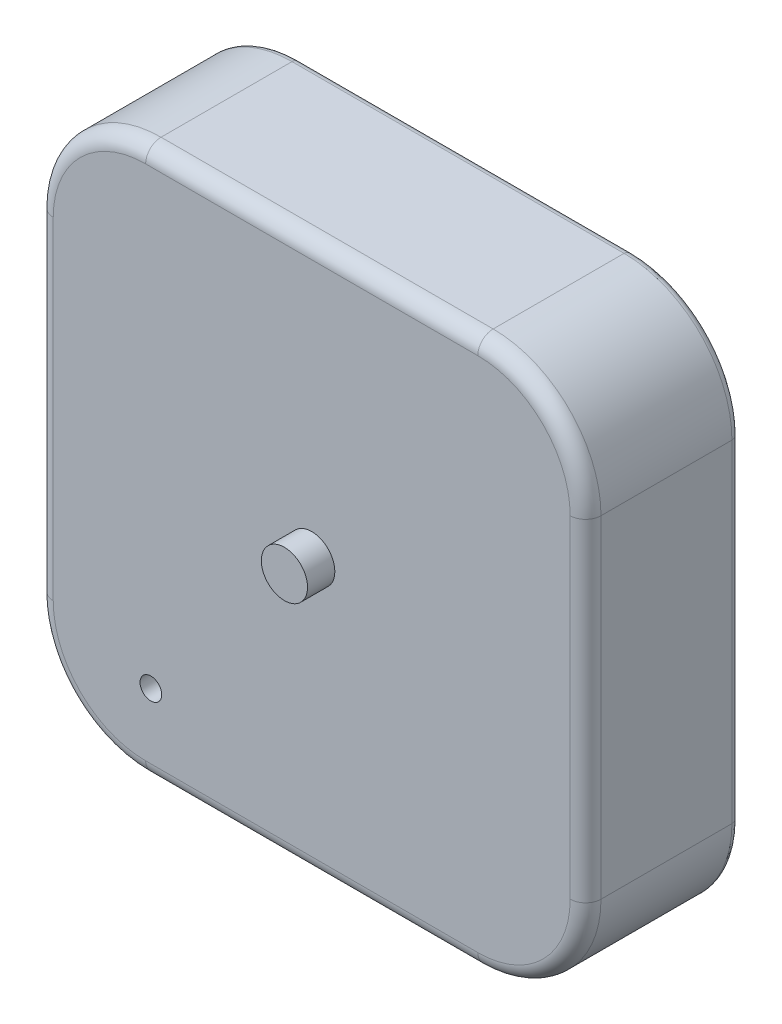
ISO-10303-21;
HEADER;
FILE_DESCRIPTION(('STEP AP214'),'2;1');
FILE_NAME('part.step','',(''),(''),'','','');
FILE_SCHEMA(('AUTOMOTIVE_DESIGN { 1 0 10303 214 1 1 1 1 }'));
ENDSEC;
DATA;
#1=APPLICATION_CONTEXT('core data for automotive mechanical design processes');
#2=APPLICATION_PROTOCOL_DEFINITION('international standard','automotive_design',2000,#1);
#3=PRODUCT_CONTEXT('',#1,'mechanical');
#4=PRODUCT('Part','Part','',(#3));
#5=PRODUCT_RELATED_PRODUCT_CATEGORY('part','',(#4));
#6=PRODUCT_DEFINITION_FORMATION('','',#4);
#7=PRODUCT_DEFINITION_CONTEXT('part definition',#1,'design');
#8=PRODUCT_DEFINITION('design','',#6,#7);
#9=PRODUCT_DEFINITION_SHAPE('','',#8);
#10=(LENGTH_UNIT() NAMED_UNIT(*) SI_UNIT(.MILLI.,.METRE.));
#11=(NAMED_UNIT(*) PLANE_ANGLE_UNIT() SI_UNIT($,.RADIAN.));
#12=(NAMED_UNIT(*) SI_UNIT($,.STERADIAN.) SOLID_ANGLE_UNIT());
#13=UNCERTAINTY_MEASURE_WITH_UNIT(LENGTH_MEASURE(1.E-05),#10,'distance_accuracy_value','');
#14=(GEOMETRIC_REPRESENTATION_CONTEXT(3) GLOBAL_UNCERTAINTY_ASSIGNED_CONTEXT((#13)) GLOBAL_UNIT_ASSIGNED_CONTEXT((#10,
#11,#12)) REPRESENTATION_CONTEXT('',''));
#15=CARTESIAN_POINT('',(0.,0.,0.));
#16=DIRECTION('',(0.,0.,1.));
#17=DIRECTION('',(1.,0.,0.));
#18=AXIS2_PLACEMENT_3D('',#15,#16,#17);
#19=CARTESIAN_POINT('',(0.,0.,0.));
#20=DIRECTION('',(0.,0.,1.));
#21=DIRECTION('',(1.,0.,0.));
#22=AXIS2_PLACEMENT_3D('',#19,#20,#21);
#23=PLANE('',#22);
#24=DIRECTION('',(1.,0.,0.));
#25=VECTOR('',#24,1.);
#26=CARTESIAN_POINT('',(0.,-172.8,0.));
#27=LINE('',#26,#25);
#28=CARTESIAN_POINT('',(107.8,-172.8,0.));
#29=VERTEX_POINT('',#28);
#30=CARTESIAN_POINT('',(-107.8,-172.8,0.));
#31=VERTEX_POINT('',#30);
#32=EDGE_CURVE('E189',#29,#31,#27,.F.);
#33=ORIENTED_EDGE('',*,*,#32,.T.);
#34=CARTESIAN_POINT('',(-107.8,-107.8,0.));
#35=DIRECTION('',(0.,0.,1.));
#36=DIRECTION('',(1.,0.,0.));
#37=AXIS2_PLACEMENT_3D('',#34,#35,#36);
#38=CIRCLE('',#37,65.);
#39=CARTESIAN_POINT('',(-172.8,-107.8,0.));
#40=VERTEX_POINT('',#39);
#41=EDGE_CURVE('E238',#31,#40,#38,.F.);
#42=ORIENTED_EDGE('',*,*,#41,.T.);
#43=DIRECTION('',(0.,-1.,0.));
#44=VECTOR('',#43,1.);
#45=CARTESIAN_POINT('',(-172.8,0.,0.));
#46=LINE('',#45,#44);
#47=CARTESIAN_POINT('',(-172.8,107.8,0.));
#48=VERTEX_POINT('',#47);
#49=EDGE_CURVE('E235',#40,#48,#46,.F.);
#50=ORIENTED_EDGE('',*,*,#49,.T.);
#51=CARTESIAN_POINT('',(-107.8,107.8,0.));
#52=DIRECTION('',(0.,0.,1.));
#53=DIRECTION('',(1.,0.,0.));
#54=AXIS2_PLACEMENT_3D('',#51,#52,#53);
#55=CIRCLE('',#54,65.);
#56=CARTESIAN_POINT('',(-107.8,172.8,0.));
#57=VERTEX_POINT('',#56);
#58=EDGE_CURVE('E232',#48,#57,#55,.F.);
#59=ORIENTED_EDGE('',*,*,#58,.T.);
#60=DIRECTION('',(1.,0.,0.));
#61=VECTOR('',#60,1.);
#62=CARTESIAN_POINT('',(107.8,172.8,0.));
#63=LINE('',#62,#61);
#64=CARTESIAN_POINT('',(107.8,172.8,0.));
#65=VERTEX_POINT('',#64);
#66=EDGE_CURVE('E229',#57,#65,#63,.T.);
#67=ORIENTED_EDGE('',*,*,#66,.T.);
#68=CARTESIAN_POINT('',(107.8,107.8,0.));
#69=DIRECTION('',(0.,0.,1.));
#70=DIRECTION('',(1.,0.,0.));
#71=AXIS2_PLACEMENT_3D('',#68,#69,#70);
#72=CIRCLE('',#71,65.);
#73=CARTESIAN_POINT('',(172.8,107.8,0.));
#74=VERTEX_POINT('',#73);
#75=EDGE_CURVE('E226',#65,#74,#72,.F.);
#76=ORIENTED_EDGE('',*,*,#75,.T.);
#77=DIRECTION('',(0.,-1.,0.));
#78=VECTOR('',#77,1.);
#79=CARTESIAN_POINT('',(172.8,-107.8,0.));
#80=LINE('',#79,#78);
#81=CARTESIAN_POINT('',(172.8,-107.8,0.));
#82=VERTEX_POINT('',#81);
#83=EDGE_CURVE('E192',#74,#82,#80,.T.);
#84=ORIENTED_EDGE('',*,*,#83,.T.);
#85=CARTESIAN_POINT('',(107.8,-107.8,0.));
#86=DIRECTION('',(0.,0.,1.));
#87=DIRECTION('',(1.,0.,0.));
#88=AXIS2_PLACEMENT_3D('',#85,#86,#87);
#89=CIRCLE('',#88,65.);
#90=EDGE_CURVE('E185',#82,#29,#89,.F.);
#91=ORIENTED_EDGE('',*,*,#90,.T.);
#92=EDGE_LOOP('',(#33,#42,#50,#59,#67,#76,#84,#91));
#93=FACE_BOUND('',#92,.T.);
#94=ADVANCED_FACE('F70',(#93),#23,.F.);
#95=CARTESIAN_POINT('',(-177.8,0.,100.));
#96=DIRECTION('',(1.,0.,0.));
#97=DIRECTION('',(0.,1.,0.));
#98=AXIS2_PLACEMENT_3D('',#95,#96,#97);
#99=PLANE('',#98);
#100=DIRECTION('',(0.,0.,-1.));
#101=VECTOR('',#100,1.);
#102=CARTESIAN_POINT('',(-177.8,-107.8,100.));
#103=LINE('',#102,#101);
#104=CARTESIAN_POINT('',(-177.8,-107.8,5.));
#105=VERTEX_POINT('',#104);
#106=CARTESIAN_POINT('',(-177.8,-107.8,90.));
#107=VERTEX_POINT('',#106);
#108=EDGE_CURVE('E215',#105,#107,#103,.F.);
#109=ORIENTED_EDGE('',*,*,#108,.T.);
#110=DIRECTION('',(0.,-1.,0.));
#111=VECTOR('',#110,1.);
#112=CARTESIAN_POINT('',(-177.8,107.8,90.));
#113=LINE('',#112,#111);
#114=CARTESIAN_POINT('',(-177.8,107.8,90.));
#115=VERTEX_POINT('',#114);
#116=EDGE_CURVE('E319',#107,#115,#113,.F.);
#117=ORIENTED_EDGE('',*,*,#116,.T.);
#118=DIRECTION('',(0.,0.,-1.));
#119=VECTOR('',#118,1.);
#120=CARTESIAN_POINT('',(-177.8,107.8,0.));
#121=LINE('',#120,#119);
#122=CARTESIAN_POINT('',(-177.8,107.8,5.));
#123=VERTEX_POINT('',#122);
#124=EDGE_CURVE('E220',#115,#123,#121,.T.);
#125=ORIENTED_EDGE('',*,*,#124,.T.);
#126=DIRECTION('',(0.,-1.,0.));
#127=VECTOR('',#126,1.);
#128=CARTESIAN_POINT('',(-177.8,0.,5.));
#129=LINE('',#128,#127);
#130=EDGE_CURVE('E245',#123,#105,#129,.T.);
#131=ORIENTED_EDGE('',*,*,#130,.T.);
#132=EDGE_LOOP('',(#109,#117,#125,#131));
#133=FACE_BOUND('',#132,.T.);
#134=ADVANCED_FACE('F402',(#133),#99,.F.);
#135=CARTESIAN_POINT('',(0.,177.8,100.));
#136=DIRECTION('',(0.,1.,0.));
#137=DIRECTION('',(0.,0.,1.));
#138=AXIS2_PLACEMENT_3D('',#135,#136,#137);
#139=PLANE('',#138);
#140=DIRECTION('',(0.,0.,-1.));
#141=VECTOR('',#140,1.);
#142=CARTESIAN_POINT('',(-107.8,177.8,100.));
#143=LINE('',#142,#141);
#144=CARTESIAN_POINT('',(-107.8,177.8,5.));
#145=VERTEX_POINT('',#144);
#146=CARTESIAN_POINT('',(-107.8,177.8,90.));
#147=VERTEX_POINT('',#146);
#148=EDGE_CURVE('E413',#145,#147,#143,.F.);
#149=ORIENTED_EDGE('',*,*,#148,.T.);
#150=DIRECTION('',(1.,0.,0.));
#151=VECTOR('',#150,1.);
#152=CARTESIAN_POINT('',(0.,177.8,90.));
#153=LINE('',#152,#151);
#154=CARTESIAN_POINT('',(107.8,177.8,90.));
#155=VERTEX_POINT('',#154);
#156=EDGE_CURVE('E325',#147,#155,#153,.T.);
#157=ORIENTED_EDGE('',*,*,#156,.T.);
#158=DIRECTION('',(0.,0.,-1.));
#159=VECTOR('',#158,1.);
#160=CARTESIAN_POINT('',(107.8,177.8,100.));
#161=LINE('',#160,#159);
#162=CARTESIAN_POINT('',(107.8,177.8,5.));
#163=VERTEX_POINT('',#162);
#164=EDGE_CURVE('E382',#155,#163,#161,.T.);
#165=ORIENTED_EDGE('',*,*,#164,.T.);
#166=DIRECTION('',(1.,0.,0.));
#167=VECTOR('',#166,1.);
#168=CARTESIAN_POINT('',(-107.8,177.8,5.));
#169=LINE('',#168,#167);
#170=EDGE_CURVE('E252',#163,#145,#169,.F.);
#171=ORIENTED_EDGE('',*,*,#170,.T.);
#172=EDGE_LOOP('',(#149,#157,#165,#171));
#173=FACE_BOUND('',#172,.T.);
#174=ADVANCED_FACE('F451',(#173),#139,.T.);
#175=CARTESIAN_POINT('',(177.8,0.,100.));
#176=DIRECTION('',(1.,0.,0.));
#177=DIRECTION('',(0.,1.,0.));
#178=AXIS2_PLACEMENT_3D('',#175,#176,#177);
#179=PLANE('',#178);
#180=DIRECTION('',(0.,0.,-1.));
#181=VECTOR('',#180,1.);
#182=CARTESIAN_POINT('',(177.8,107.8,100.));
#183=LINE('',#182,#181);
#184=CARTESIAN_POINT('',(177.8,107.8,5.));
#185=VERTEX_POINT('',#184);
#186=CARTESIAN_POINT('',(177.8,107.8,90.));
#187=VERTEX_POINT('',#186);
#188=EDGE_CURVE('E380',#185,#187,#183,.F.);
#189=ORIENTED_EDGE('',*,*,#188,.T.);
#190=DIRECTION('',(0.,-1.,0.));
#191=VECTOR('',#190,1.);
#192=CARTESIAN_POINT('',(177.8,0.,90.));
#193=LINE('',#192,#191);
#194=CARTESIAN_POINT('',(177.8,-107.8,90.));
#195=VERTEX_POINT('',#194);
#196=EDGE_CURVE('E95',#187,#195,#193,.T.);
#197=ORIENTED_EDGE('',*,*,#196,.T.);
#198=DIRECTION('',(0.,0.,-1.));
#199=VECTOR('',#198,1.);
#200=CARTESIAN_POINT('',(177.8,-107.8,0.));
#201=LINE('',#200,#199);
#202=CARTESIAN_POINT('',(177.8,-107.8,5.));
#203=VERTEX_POINT('',#202);
#204=EDGE_CURVE('E387',#195,#203,#201,.T.);
#205=ORIENTED_EDGE('',*,*,#204,.T.);
#206=DIRECTION('',(0.,-1.,0.));
#207=VECTOR('',#206,1.);
#208=CARTESIAN_POINT('',(177.8,107.8,5.));
#209=LINE('',#208,#207);
#210=EDGE_CURVE('E259',#203,#185,#209,.F.);
#211=ORIENTED_EDGE('',*,*,#210,.T.);
#212=EDGE_LOOP('',(#189,#197,#205,#211));
#213=FACE_BOUND('',#212,.T.);
#214=ADVANCED_FACE('F383',(#213),#179,.T.);
#215=CARTESIAN_POINT('',(0.,-177.8,100.));
#216=DIRECTION('',(0.,1.,0.));
#217=DIRECTION('',(0.,0.,1.));
#218=AXIS2_PLACEMENT_3D('',#215,#216,#217);
#219=PLANE('',#218);
#220=DIRECTION('',(0.,0.,-1.));
#221=VECTOR('',#220,1.);
#222=CARTESIAN_POINT('',(107.8,-177.8,100.));
#223=LINE('',#222,#221);
#224=CARTESIAN_POINT('',(107.8,-177.8,5.));
#225=VERTEX_POINT('',#224);
#226=CARTESIAN_POINT('',(107.8,-177.8,90.));
#227=VERTEX_POINT('',#226);
#228=EDGE_CURVE('E392',#225,#227,#223,.F.);
#229=ORIENTED_EDGE('',*,*,#228,.T.);
#230=DIRECTION('',(1.,0.,0.));
#231=VECTOR('',#230,1.);
#232=CARTESIAN_POINT('',(-107.8,-177.8,90.));
#233=LINE('',#232,#231);
#234=CARTESIAN_POINT('',(-107.8,-177.8,90.));
#235=VERTEX_POINT('',#234);
#236=EDGE_CURVE('E12',#227,#235,#233,.F.);
#237=ORIENTED_EDGE('',*,*,#236,.T.);
#238=DIRECTION('',(0.,0.,-1.));
#239=VECTOR('',#238,1.);
#240=CARTESIAN_POINT('',(-107.8,-177.8,100.));
#241=LINE('',#240,#239);
#242=CARTESIAN_POINT('',(-107.8,-177.8,5.));
#243=VERTEX_POINT('',#242);
#244=EDGE_CURVE('E386',#235,#243,#241,.T.);
#245=ORIENTED_EDGE('',*,*,#244,.T.);
#246=DIRECTION('',(1.,0.,0.));
#247=VECTOR('',#246,1.);
#248=CARTESIAN_POINT('',(0.,-177.8,5.));
#249=LINE('',#248,#247);
#250=EDGE_CURVE('E264',#243,#225,#249,.T.);
#251=ORIENTED_EDGE('',*,*,#250,.T.);
#252=EDGE_LOOP('',(#229,#237,#245,#251));
#253=FACE_BOUND('',#252,.T.);
#254=ADVANCED_FACE('F483',(#253),#219,.F.);
#255=CARTESIAN_POINT('',(0.,0.,100.));
#256=DIRECTION('',(0.,0.,1.));
#257=DIRECTION('',(1.,0.,0.));
#258=AXIS2_PLACEMENT_3D('',#255,#256,#257);
#259=PLANE('',#258);
#260=CARTESIAN_POINT('',(0.,0.,100.));
#261=DIRECTION('',(0.,0.,1.));
#262=DIRECTION('',(1.,0.,0.));
#263=AXIS2_PLACEMENT_3D('',#260,#261,#262);
#264=CIRCLE('',#263,15.);
#265=CARTESIAN_POINT('',(15.,0.,100.));
#266=VERTEX_POINT('',#265);
#267=EDGE_CURVE('E465',#266,#266,#264,.T.);
#268=ORIENTED_EDGE('',*,*,#267,.F.);
#269=EDGE_LOOP('',(#268));
#270=FACE_BOUND('',#269,.T.);
#271=DIRECTION('',(0.,-1.,0.));
#272=VECTOR('',#271,1.);
#273=CARTESIAN_POINT('',(-167.8,-107.8,100.));
#274=LINE('',#273,#272);
#275=CARTESIAN_POINT('',(-167.8,107.8,100.));
#276=VERTEX_POINT('',#275);
#277=CARTESIAN_POINT('',(-167.8,-107.8,100.));
#278=VERTEX_POINT('',#277);
#279=EDGE_CURVE('E308',#276,#278,#274,.T.);
#280=ORIENTED_EDGE('',*,*,#279,.T.);
#281=CARTESIAN_POINT('',(-107.8,-107.8,100.));
#282=DIRECTION('',(0.,0.,1.));
#283=DIRECTION('',(1.,0.,0.));
#284=AXIS2_PLACEMENT_3D('',#281,#282,#283);
#285=CIRCLE('',#284,60.);
#286=CARTESIAN_POINT('',(-107.8,-167.8,100.));
#287=VERTEX_POINT('',#286);
#288=EDGE_CURVE('E311',#278,#287,#285,.T.);
#289=ORIENTED_EDGE('',*,*,#288,.T.);
#290=DIRECTION('',(1.,0.,0.));
#291=VECTOR('',#290,1.);
#292=CARTESIAN_POINT('',(107.8,-167.8,100.));
#293=LINE('',#292,#291);
#294=CARTESIAN_POINT('',(107.8,-167.8,100.));
#295=VERTEX_POINT('',#294);
#296=EDGE_CURVE('E267',#287,#295,#293,.T.);
#297=ORIENTED_EDGE('',*,*,#296,.T.);
#298=CARTESIAN_POINT('',(107.8,-107.8,100.));
#299=DIRECTION('',(0.,0.,1.));
#300=DIRECTION('',(1.,0.,0.));
#301=AXIS2_PLACEMENT_3D('',#298,#299,#300);
#302=CIRCLE('',#301,60.);
#303=CARTESIAN_POINT('',(167.8,-107.8,100.));
#304=VERTEX_POINT('',#303);
#305=EDGE_CURVE('E293',#295,#304,#302,.T.);
#306=ORIENTED_EDGE('',*,*,#305,.T.);
#307=DIRECTION('',(0.,-1.,0.));
#308=VECTOR('',#307,1.);
#309=CARTESIAN_POINT('',(167.8,0.,100.));
#310=LINE('',#309,#308);
#311=CARTESIAN_POINT('',(167.8,107.8,100.));
#312=VERTEX_POINT('',#311);
#313=EDGE_CURVE('E296',#304,#312,#310,.F.);
#314=ORIENTED_EDGE('',*,*,#313,.T.);
#315=CARTESIAN_POINT('',(107.8,107.8,100.));
#316=DIRECTION('',(0.,0.,1.));
#317=DIRECTION('',(1.,0.,0.));
#318=AXIS2_PLACEMENT_3D('',#315,#316,#317);
#319=CIRCLE('',#318,60.);
#320=CARTESIAN_POINT('',(107.8,167.8,100.));
#321=VERTEX_POINT('',#320);
#322=EDGE_CURVE('E299',#312,#321,#319,.T.);
#323=ORIENTED_EDGE('',*,*,#322,.T.);
#324=DIRECTION('',(1.,0.,0.));
#325=VECTOR('',#324,1.);
#326=CARTESIAN_POINT('',(0.,167.8,100.));
#327=LINE('',#326,#325);
#328=CARTESIAN_POINT('',(-107.8,167.8,100.));
#329=VERTEX_POINT('',#328);
#330=EDGE_CURVE('E302',#321,#329,#327,.F.);
#331=ORIENTED_EDGE('',*,*,#330,.T.);
#332=CARTESIAN_POINT('',(-107.8,107.8,100.));
#333=DIRECTION('',(0.,0.,1.));
#334=DIRECTION('',(1.,0.,0.));
#335=AXIS2_PLACEMENT_3D('',#332,#333,#334);
#336=CIRCLE('',#335,60.);
#337=EDGE_CURVE('E305',#329,#276,#336,.T.);
#338=ORIENTED_EDGE('',*,*,#337,.T.);
#339=EDGE_LOOP('',(#280,#289,#297,#306,#314,#323,#331,#338));
#340=FACE_BOUND('',#339,.T.);
#341=CARTESIAN_POINT('',(-104.42,-125.46,100.));
#342=DIRECTION('',(0.,0.,1.));
#343=DIRECTION('',(1.,0.,0.));
#344=AXIS2_PLACEMENT_3D('',#341,#342,#343);
#345=CIRCLE('',#344,7.02999999999999);
#346=CARTESIAN_POINT('',(-97.39,-125.46,100.));
#347=VERTEX_POINT('',#346);
#348=EDGE_CURVE('E290',#347,#347,#345,.T.);
#349=ORIENTED_EDGE('',*,*,#348,.F.);
#350=EDGE_LOOP('',(#349));
#351=FACE_BOUND('',#350,.T.);
#352=ADVANCED_FACE('F441',(#270,#340,#351),#259,.T.);
#353=CARTESIAN_POINT('',(107.8,107.8,100.));
#354=DIRECTION('',(0.,0.,-1.));
#355=DIRECTION('',(-1.,0.,0.));
#356=AXIS2_PLACEMENT_3D('',#353,#354,#355);
#357=CYLINDRICAL_SURFACE('',#356,70.);
#358=ORIENTED_EDGE('',*,*,#164,.F.);
#359=CARTESIAN_POINT('',(107.8,107.8,90.));
#360=DIRECTION('',(0.,0.,1.));
#361=DIRECTION('',(1.,0.,0.));
#362=AXIS2_PLACEMENT_3D('',#359,#360,#361);
#363=CIRCLE('',#362,70.);
#364=EDGE_CURVE('E328',#155,#187,#363,.F.);
#365=ORIENTED_EDGE('',*,*,#364,.T.);
#366=ORIENTED_EDGE('',*,*,#188,.F.);
#367=CARTESIAN_POINT('',(107.8,107.8,5.));
#368=DIRECTION('',(0.,0.,1.));
#369=DIRECTION('',(1.,0.,0.));
#370=AXIS2_PLACEMENT_3D('',#367,#368,#369);
#371=CIRCLE('',#370,70.);
#372=EDGE_CURVE('E255',#185,#163,#371,.T.);
#373=ORIENTED_EDGE('',*,*,#372,.T.);
#374=EDGE_LOOP('',(#358,#365,#366,#373));
#375=FACE_BOUND('',#374,.T.);
#376=ADVANCED_FACE('F379',(#375),#357,.T.);
#377=CARTESIAN_POINT('',(107.8,-107.8,100.));
#378=DIRECTION('',(0.,0.,1.));
#379=DIRECTION('',(1.,0.,0.));
#380=AXIS2_PLACEMENT_3D('',#377,#378,#379);
#381=CYLINDRICAL_SURFACE('',#380,70.);
#382=ORIENTED_EDGE('',*,*,#204,.F.);
#383=CARTESIAN_POINT('',(107.8,-107.8,90.));
#384=DIRECTION('',(0.,0.,1.));
#385=DIRECTION('',(1.,0.,0.));
#386=AXIS2_PLACEMENT_3D('',#383,#384,#385);
#387=CIRCLE('',#386,70.);
#388=EDGE_CURVE('E80',#195,#227,#387,.F.);
#389=ORIENTED_EDGE('',*,*,#388,.T.);
#390=ORIENTED_EDGE('',*,*,#228,.F.);
#391=CARTESIAN_POINT('',(107.8,-107.8,5.));
#392=DIRECTION('',(0.,0.,1.));
#393=DIRECTION('',(1.,0.,0.));
#394=AXIS2_PLACEMENT_3D('',#391,#392,#393);
#395=CIRCLE('',#394,70.);
#396=EDGE_CURVE('E203',#225,#203,#395,.T.);
#397=ORIENTED_EDGE('',*,*,#396,.T.);
#398=EDGE_LOOP('',(#382,#389,#390,#397));
#399=FACE_BOUND('',#398,.T.);
#400=ADVANCED_FACE('F489',(#399),#381,.T.);
#401=CARTESIAN_POINT('',(-107.8,-107.8,100.));
#402=DIRECTION('',(0.,0.,-1.));
#403=DIRECTION('',(-1.,0.,0.));
#404=AXIS2_PLACEMENT_3D('',#401,#402,#403);
#405=CYLINDRICAL_SURFACE('',#404,70.);
#406=ORIENTED_EDGE('',*,*,#244,.F.);
#407=CARTESIAN_POINT('',(-107.8,-107.8,90.));
#408=DIRECTION('',(0.,0.,1.));
#409=DIRECTION('',(1.,0.,0.));
#410=AXIS2_PLACEMENT_3D('',#407,#408,#409);
#411=CIRCLE('',#410,70.);
#412=EDGE_CURVE('E315',#235,#107,#411,.F.);
#413=ORIENTED_EDGE('',*,*,#412,.T.);
#414=ORIENTED_EDGE('',*,*,#108,.F.);
#415=CARTESIAN_POINT('',(-107.8,-107.8,5.));
#416=DIRECTION('',(0.,0.,1.));
#417=DIRECTION('',(1.,0.,0.));
#418=AXIS2_PLACEMENT_3D('',#415,#416,#417);
#419=CIRCLE('',#418,70.);
#420=EDGE_CURVE('E241',#105,#243,#419,.T.);
#421=ORIENTED_EDGE('',*,*,#420,.T.);
#422=EDGE_LOOP('',(#406,#413,#414,#421));
#423=FACE_BOUND('',#422,.T.);
#424=ADVANCED_FACE('F427',(#423),#405,.T.);
#425=CARTESIAN_POINT('',(-107.8,107.8,100.));
#426=DIRECTION('',(0.,0.,1.));
#427=DIRECTION('',(1.,0.,0.));
#428=AXIS2_PLACEMENT_3D('',#425,#426,#427);
#429=CYLINDRICAL_SURFACE('',#428,70.);
#430=ORIENTED_EDGE('',*,*,#124,.F.);
#431=CARTESIAN_POINT('',(-107.8,107.8,90.));
#432=DIRECTION('',(0.,0.,1.));
#433=DIRECTION('',(1.,0.,0.));
#434=AXIS2_PLACEMENT_3D('',#431,#432,#433);
#435=CIRCLE('',#434,70.);
#436=EDGE_CURVE('E322',#115,#147,#435,.F.);
#437=ORIENTED_EDGE('',*,*,#436,.T.);
#438=ORIENTED_EDGE('',*,*,#148,.F.);
#439=CARTESIAN_POINT('',(-107.8,107.8,5.));
#440=DIRECTION('',(0.,0.,1.));
#441=DIRECTION('',(1.,0.,0.));
#442=AXIS2_PLACEMENT_3D('',#439,#440,#441);
#443=CIRCLE('',#442,70.);
#444=EDGE_CURVE('E248',#145,#123,#443,.T.);
#445=ORIENTED_EDGE('',*,*,#444,.T.);
#446=EDGE_LOOP('',(#430,#437,#438,#445));
#447=FACE_BOUND('',#446,.T.);
#448=ADVANCED_FACE('F411',(#447),#429,.T.);
#449=CARTESIAN_POINT('',(-104.42,-125.46,74.96));
#450=DIRECTION('',(0.,0.,1.));
#451=DIRECTION('',(1.,0.,0.));
#452=AXIS2_PLACEMENT_3D('',#449,#450,#451);
#453=CYLINDRICAL_SURFACE('',#452,7.02999999999999);
#454=CARTESIAN_POINT('',(-104.42,-125.46,74.96));
#455=DIRECTION('',(0.,0.,1.));
#456=DIRECTION('',(1.,0.,0.));
#457=AXIS2_PLACEMENT_3D('',#454,#455,#456);
#458=CIRCLE('',#457,7.02999999999999);
#459=CARTESIAN_POINT('',(-97.39,-125.46,74.96));
#460=VERTEX_POINT('',#459);
#461=EDGE_CURVE('E454',#460,#460,#458,.T.);
#462=ORIENTED_EDGE('',*,*,#461,.F.);
#463=EDGE_LOOP('',(#462));
#464=FACE_BOUND('',#463,.T.);
#465=ORIENTED_EDGE('',*,*,#348,.T.);
#466=EDGE_LOOP('',(#465));
#467=FACE_BOUND('',#466,.T.);
#468=ADVANCED_FACE('F511',(#464,#467),#453,.F.);
#469=CARTESIAN_POINT('',(-104.42,-125.46,74.96));
#470=DIRECTION('',(0.,0.,1.));
#471=DIRECTION('',(1.,0.,0.));
#472=AXIS2_PLACEMENT_3D('',#469,#470,#471);
#473=PLANE('',#472);
#474=ORIENTED_EDGE('',*,*,#461,.T.);
#475=EDGE_LOOP('',(#474));
#476=FACE_BOUND('',#475,.T.);
#477=ADVANCED_FACE('F533',(#476),#473,.T.);
#478=CARTESIAN_POINT('',(107.8,107.8,5.));
#479=DIRECTION('',(0.,0.,1.));
#480=DIRECTION('',(1.,0.,0.));
#481=AXIS2_PLACEMENT_3D('',#478,#479,#480);
#482=TOROIDAL_SURFACE('',#481,65.,5.);
#483=CARTESIAN_POINT('',(107.8,172.8,5.));
#484=DIRECTION('',(-1.,0.,0.));
#485=DIRECTION('',(0.,0.,1.));
#486=AXIS2_PLACEMENT_3D('',#483,#484,#485);
#487=CIRCLE('',#486,5.);
#488=EDGE_CURVE('E282',#163,#65,#487,.T.);
#489=ORIENTED_EDGE('',*,*,#488,.F.);
#490=ORIENTED_EDGE('',*,*,#372,.F.);
#491=CARTESIAN_POINT('',(172.8,107.8,5.));
#492=DIRECTION('',(0.,-1.,0.));
#493=DIRECTION('',(0.,0.,-1.));
#494=AXIS2_PLACEMENT_3D('',#491,#492,#493);
#495=CIRCLE('',#494,5.);
#496=EDGE_CURVE('E286',#74,#185,#495,.T.);
#497=ORIENTED_EDGE('',*,*,#496,.F.);
#498=ORIENTED_EDGE('',*,*,#75,.F.);
#499=EDGE_LOOP('',(#489,#490,#497,#498));
#500=FACE_BOUND('',#499,.T.);
#501=ADVANCED_FACE('F529',(#500),#482,.T.);
#502=CARTESIAN_POINT('',(172.8,0.,5.));
#503=DIRECTION('',(0.,1.,0.));
#504=DIRECTION('',(-1.,0.,0.));
#505=AXIS2_PLACEMENT_3D('',#502,#503,#504);
#506=CYLINDRICAL_SURFACE('',#505,5.);
#507=ORIENTED_EDGE('',*,*,#496,.T.);
#508=ORIENTED_EDGE('',*,*,#210,.F.);
#509=CARTESIAN_POINT('',(172.8,-107.8,5.));
#510=DIRECTION('',(0.,-1.,0.));
#511=DIRECTION('',(0.,0.,-1.));
#512=AXIS2_PLACEMENT_3D('',#509,#510,#511);
#513=CIRCLE('',#512,5.);
#514=EDGE_CURVE('E279',#82,#203,#513,.T.);
#515=ORIENTED_EDGE('',*,*,#514,.F.);
#516=ORIENTED_EDGE('',*,*,#83,.F.);
#517=EDGE_LOOP('',(#507,#508,#515,#516));
#518=FACE_BOUND('',#517,.T.);
#519=ADVANCED_FACE('F525',(#518),#506,.T.);
#520=CARTESIAN_POINT('',(0.,172.8,5.));
#521=DIRECTION('',(-1.,0.,0.));
#522=DIRECTION('',(0.,0.,1.));
#523=AXIS2_PLACEMENT_3D('',#520,#521,#522);
#524=CYLINDRICAL_SURFACE('',#523,5.);
#525=ORIENTED_EDGE('',*,*,#488,.T.);
#526=ORIENTED_EDGE('',*,*,#66,.F.);
#527=CARTESIAN_POINT('',(-107.8,172.8,5.));
#528=DIRECTION('',(-1.,0.,0.));
#529=DIRECTION('',(0.,0.,1.));
#530=AXIS2_PLACEMENT_3D('',#527,#528,#529);
#531=CIRCLE('',#530,5.);
#532=EDGE_CURVE('E207',#145,#57,#531,.T.);
#533=ORIENTED_EDGE('',*,*,#532,.F.);
#534=ORIENTED_EDGE('',*,*,#170,.F.);
#535=EDGE_LOOP('',(#525,#526,#533,#534));
#536=FACE_BOUND('',#535,.T.);
#537=ADVANCED_FACE('F522',(#536),#524,.T.);
#538=CARTESIAN_POINT('',(107.8,-107.8,5.));
#539=DIRECTION('',(0.,0.,1.));
#540=DIRECTION('',(1.,0.,0.));
#541=AXIS2_PLACEMENT_3D('',#538,#539,#540);
#542=TOROIDAL_SURFACE('',#541,65.,5.);
#543=ORIENTED_EDGE('',*,*,#514,.T.);
#544=ORIENTED_EDGE('',*,*,#396,.F.);
#545=CARTESIAN_POINT('',(107.8,-172.8,5.));
#546=DIRECTION('',(-1.,0.,0.));
#547=DIRECTION('',(0.,0.,1.));
#548=AXIS2_PLACEMENT_3D('',#545,#546,#547);
#549=CIRCLE('',#548,5.);
#550=EDGE_CURVE('E200',#29,#225,#549,.T.);
#551=ORIENTED_EDGE('',*,*,#550,.F.);
#552=ORIENTED_EDGE('',*,*,#90,.F.);
#553=EDGE_LOOP('',(#543,#544,#551,#552));
#554=FACE_BOUND('',#553,.T.);
#555=ADVANCED_FACE('F201',(#554),#542,.T.);
#556=CARTESIAN_POINT('',(-107.8,107.8,5.));
#557=DIRECTION('',(0.,0.,1.));
#558=DIRECTION('',(1.,0.,0.));
#559=AXIS2_PLACEMENT_3D('',#556,#557,#558);
#560=TOROIDAL_SURFACE('',#559,65.,5.);
#561=ORIENTED_EDGE('',*,*,#532,.T.);
#562=ORIENTED_EDGE('',*,*,#58,.F.);
#563=CARTESIAN_POINT('',(-172.8,107.8,5.));
#564=DIRECTION('',(0.,-1.,0.));
#565=DIRECTION('',(0.,0.,-1.));
#566=AXIS2_PLACEMENT_3D('',#563,#564,#565);
#567=CIRCLE('',#566,5.);
#568=EDGE_CURVE('E208',#123,#48,#567,.T.);
#569=ORIENTED_EDGE('',*,*,#568,.F.);
#570=ORIENTED_EDGE('',*,*,#444,.F.);
#571=EDGE_LOOP('',(#561,#562,#569,#570));
#572=FACE_BOUND('',#571,.T.);
#573=ADVANCED_FACE('F417',(#572),#560,.T.);
#574=CARTESIAN_POINT('',(0.,-172.8,5.));
#575=DIRECTION('',(1.,0.,0.));
#576=DIRECTION('',(0.,0.,-1.));
#577=AXIS2_PLACEMENT_3D('',#574,#575,#576);
#578=CYLINDRICAL_SURFACE('',#577,5.);
#579=ORIENTED_EDGE('',*,*,#550,.T.);
#580=ORIENTED_EDGE('',*,*,#250,.F.);
#581=CARTESIAN_POINT('',(-107.8,-172.8,5.));
#582=DIRECTION('',(-1.,0.,0.));
#583=DIRECTION('',(0.,0.,1.));
#584=AXIS2_PLACEMENT_3D('',#581,#582,#583);
#585=CIRCLE('',#584,5.);
#586=EDGE_CURVE('E212',#31,#243,#585,.T.);
#587=ORIENTED_EDGE('',*,*,#586,.F.);
#588=ORIENTED_EDGE('',*,*,#32,.F.);
#589=EDGE_LOOP('',(#579,#580,#587,#588));
#590=FACE_BOUND('',#589,.T.);
#591=ADVANCED_FACE('F210',(#590),#578,.T.);
#592=CARTESIAN_POINT('',(-172.8,0.,5.));
#593=DIRECTION('',(0.,-1.,0.));
#594=DIRECTION('',(1.,0.,0.));
#595=AXIS2_PLACEMENT_3D('',#592,#593,#594);
#596=CYLINDRICAL_SURFACE('',#595,5.);
#597=ORIENTED_EDGE('',*,*,#568,.T.);
#598=ORIENTED_EDGE('',*,*,#49,.F.);
#599=CARTESIAN_POINT('',(-172.8,-107.8,5.));
#600=DIRECTION('',(0.,-1.,0.));
#601=DIRECTION('',(0.,0.,-1.));
#602=AXIS2_PLACEMENT_3D('',#599,#600,#601);
#603=CIRCLE('',#602,5.);
#604=EDGE_CURVE('E268',#105,#40,#603,.T.);
#605=ORIENTED_EDGE('',*,*,#604,.F.);
#606=ORIENTED_EDGE('',*,*,#130,.F.);
#607=EDGE_LOOP('',(#597,#598,#605,#606));
#608=FACE_BOUND('',#607,.T.);
#609=ADVANCED_FACE('F421',(#608),#596,.T.);
#610=CARTESIAN_POINT('',(-107.8,-107.8,5.));
#611=DIRECTION('',(0.,0.,1.));
#612=DIRECTION('',(1.,0.,0.));
#613=AXIS2_PLACEMENT_3D('',#610,#611,#612);
#614=TOROIDAL_SURFACE('',#613,65.,5.);
#615=ORIENTED_EDGE('',*,*,#586,.T.);
#616=ORIENTED_EDGE('',*,*,#420,.F.);
#617=ORIENTED_EDGE('',*,*,#604,.T.);
#618=ORIENTED_EDGE('',*,*,#41,.F.);
#619=EDGE_LOOP('',(#615,#616,#617,#618));
#620=FACE_BOUND('',#619,.T.);
#621=ADVANCED_FACE('F424',(#620),#614,.T.);
#622=CARTESIAN_POINT('',(107.8,107.8,90.));
#623=DIRECTION('',(0.,0.,1.));
#624=DIRECTION('',(1.,0.,0.));
#625=AXIS2_PLACEMENT_3D('',#622,#623,#624);
#626=TOROIDAL_SURFACE('',#625,60.,10.);
#627=CARTESIAN_POINT('',(167.8,107.8,90.));
#628=DIRECTION('',(0.,-1.,0.));
#629=DIRECTION('',(0.,0.,-1.));
#630=AXIS2_PLACEMENT_3D('',#627,#628,#629);
#631=CIRCLE('',#630,10.);
#632=EDGE_CURVE('E357',#187,#312,#631,.T.);
#633=ORIENTED_EDGE('',*,*,#632,.F.);
#634=ORIENTED_EDGE('',*,*,#364,.F.);
#635=CARTESIAN_POINT('',(107.8,167.8,90.));
#636=DIRECTION('',(-1.,0.,0.));
#637=DIRECTION('',(0.,0.,1.));
#638=AXIS2_PLACEMENT_3D('',#635,#636,#637);
#639=CIRCLE('',#638,10.);
#640=EDGE_CURVE('E74',#321,#155,#639,.T.);
#641=ORIENTED_EDGE('',*,*,#640,.F.);
#642=ORIENTED_EDGE('',*,*,#322,.F.);
#643=EDGE_LOOP('',(#633,#634,#641,#642));
#644=FACE_BOUND('',#643,.T.);
#645=ADVANCED_FACE('F72',(#644),#626,.T.);
#646=CARTESIAN_POINT('',(0.,167.8,90.));
#647=DIRECTION('',(1.,0.,0.));
#648=DIRECTION('',(0.,0.,-1.));
#649=AXIS2_PLACEMENT_3D('',#646,#647,#648);
#650=CYLINDRICAL_SURFACE('',#649,10.);
#651=ORIENTED_EDGE('',*,*,#640,.T.);
#652=ORIENTED_EDGE('',*,*,#156,.F.);
#653=CARTESIAN_POINT('',(-107.8,167.8,90.));
#654=DIRECTION('',(-1.,0.,0.));
#655=DIRECTION('',(0.,0.,1.));
#656=AXIS2_PLACEMENT_3D('',#653,#654,#655);
#657=CIRCLE('',#656,10.);
#658=EDGE_CURVE('E354',#329,#147,#657,.T.);
#659=ORIENTED_EDGE('',*,*,#658,.F.);
#660=ORIENTED_EDGE('',*,*,#330,.F.);
#661=EDGE_LOOP('',(#651,#652,#659,#660));
#662=FACE_BOUND('',#661,.T.);
#663=ADVANCED_FACE('F371',(#662),#650,.T.);
#664=CARTESIAN_POINT('',(167.8,0.,90.));
#665=DIRECTION('',(0.,-1.,0.));
#666=DIRECTION('',(1.,0.,0.));
#667=AXIS2_PLACEMENT_3D('',#664,#665,#666);
#668=CYLINDRICAL_SURFACE('',#667,10.);
#669=ORIENTED_EDGE('',*,*,#632,.T.);
#670=ORIENTED_EDGE('',*,*,#313,.F.);
#671=CARTESIAN_POINT('',(167.8,-107.8,90.));
#672=DIRECTION('',(0.,-1.,0.));
#673=DIRECTION('',(0.,0.,-1.));
#674=AXIS2_PLACEMENT_3D('',#671,#672,#673);
#675=CIRCLE('',#674,10.);
#676=EDGE_CURVE('E350',#195,#304,#675,.T.);
#677=ORIENTED_EDGE('',*,*,#676,.F.);
#678=ORIENTED_EDGE('',*,*,#196,.F.);
#679=EDGE_LOOP('',(#669,#670,#677,#678));
#680=FACE_BOUND('',#679,.T.);
#681=ADVANCED_FACE('F547',(#680),#668,.T.);
#682=CARTESIAN_POINT('',(-107.8,107.8,90.));
#683=DIRECTION('',(0.,0.,1.));
#684=DIRECTION('',(1.,0.,0.));
#685=AXIS2_PLACEMENT_3D('',#682,#683,#684);
#686=TOROIDAL_SURFACE('',#685,60.,10.);
#687=ORIENTED_EDGE('',*,*,#658,.T.);
#688=ORIENTED_EDGE('',*,*,#436,.F.);
#689=CARTESIAN_POINT('',(-167.8,107.8,90.));
#690=DIRECTION('',(0.,-1.,0.));
#691=DIRECTION('',(0.,0.,-1.));
#692=AXIS2_PLACEMENT_3D('',#689,#690,#691);
#693=CIRCLE('',#692,10.);
#694=EDGE_CURVE('E346',#276,#115,#693,.T.);
#695=ORIENTED_EDGE('',*,*,#694,.F.);
#696=ORIENTED_EDGE('',*,*,#337,.F.);
#697=EDGE_LOOP('',(#687,#688,#695,#696));
#698=FACE_BOUND('',#697,.T.);
#699=ADVANCED_FACE('F449',(#698),#686,.T.);
#700=CARTESIAN_POINT('',(107.8,-107.8,90.));
#701=DIRECTION('',(0.,0.,1.));
#702=DIRECTION('',(1.,0.,0.));
#703=AXIS2_PLACEMENT_3D('',#700,#701,#702);
#704=TOROIDAL_SURFACE('',#703,60.,10.);
#705=ORIENTED_EDGE('',*,*,#676,.T.);
#706=ORIENTED_EDGE('',*,*,#305,.F.);
#707=CARTESIAN_POINT('',(107.8,-167.8,90.));
#708=DIRECTION('',(-1.,0.,0.));
#709=DIRECTION('',(0.,0.,1.));
#710=AXIS2_PLACEMENT_3D('',#707,#708,#709);
#711=CIRCLE('',#710,10.);
#712=EDGE_CURVE('E342',#227,#295,#711,.T.);
#713=ORIENTED_EDGE('',*,*,#712,.F.);
#714=ORIENTED_EDGE('',*,*,#388,.F.);
#715=EDGE_LOOP('',(#705,#706,#713,#714));
#716=FACE_BOUND('',#715,.T.);
#717=ADVANCED_FACE('F541',(#716),#704,.T.);
#718=CARTESIAN_POINT('',(-167.8,0.,90.));
#719=DIRECTION('',(0.,1.,0.));
#720=DIRECTION('',(-1.,0.,0.));
#721=AXIS2_PLACEMENT_3D('',#718,#719,#720);
#722=CYLINDRICAL_SURFACE('',#721,10.);
#723=ORIENTED_EDGE('',*,*,#694,.T.);
#724=ORIENTED_EDGE('',*,*,#116,.F.);
#725=CARTESIAN_POINT('',(-167.8,-107.8,90.));
#726=DIRECTION('',(0.,-1.,0.));
#727=DIRECTION('',(0.,0.,-1.));
#728=AXIS2_PLACEMENT_3D('',#725,#726,#727);
#729=CIRCLE('',#728,10.);
#730=EDGE_CURVE('E338',#278,#107,#729,.T.);
#731=ORIENTED_EDGE('',*,*,#730,.F.);
#732=ORIENTED_EDGE('',*,*,#279,.F.);
#733=EDGE_LOOP('',(#723,#724,#731,#732));
#734=FACE_BOUND('',#733,.T.);
#735=ADVANCED_FACE('F447',(#734),#722,.T.);
#736=CARTESIAN_POINT('',(0.,-167.8,90.));
#737=DIRECTION('',(-1.,0.,0.));
#738=DIRECTION('',(0.,0.,1.));
#739=AXIS2_PLACEMENT_3D('',#736,#737,#738);
#740=CYLINDRICAL_SURFACE('',#739,10.);
#741=ORIENTED_EDGE('',*,*,#712,.T.);
#742=ORIENTED_EDGE('',*,*,#296,.F.);
#743=CARTESIAN_POINT('',(-107.8,-167.8,90.));
#744=DIRECTION('',(-1.,0.,0.));
#745=DIRECTION('',(0.,0.,1.));
#746=AXIS2_PLACEMENT_3D('',#743,#744,#745);
#747=CIRCLE('',#746,10.);
#748=EDGE_CURVE('E335',#235,#287,#747,.T.);
#749=ORIENTED_EDGE('',*,*,#748,.F.);
#750=ORIENTED_EDGE('',*,*,#236,.F.);
#751=EDGE_LOOP('',(#741,#742,#749,#750));
#752=FACE_BOUND('',#751,.T.);
#753=ADVANCED_FACE('F437',(#752),#740,.T.);
#754=CARTESIAN_POINT('',(-107.8,-107.8,90.));
#755=DIRECTION('',(0.,0.,1.));
#756=DIRECTION('',(1.,0.,0.));
#757=AXIS2_PLACEMENT_3D('',#754,#755,#756);
#758=TOROIDAL_SURFACE('',#757,60.,10.);
#759=ORIENTED_EDGE('',*,*,#730,.T.);
#760=ORIENTED_EDGE('',*,*,#412,.F.);
#761=ORIENTED_EDGE('',*,*,#748,.T.);
#762=ORIENTED_EDGE('',*,*,#288,.F.);
#763=EDGE_LOOP('',(#759,#760,#761,#762));
#764=FACE_BOUND('',#763,.T.);
#765=ADVANCED_FACE('F431',(#764),#758,.T.);
#766=CARTESIAN_POINT('',(0.,0.,117.7));
#767=DIRECTION('',(0.,0.,-1.));
#768=DIRECTION('',(-1.,0.,0.));
#769=AXIS2_PLACEMENT_3D('',#766,#767,#768);
#770=CYLINDRICAL_SURFACE('',#769,15.);
#771=CARTESIAN_POINT('',(0.,0.,117.7));
#772=DIRECTION('',(0.,0.,1.));
#773=DIRECTION('',(1.,0.,0.));
#774=AXIS2_PLACEMENT_3D('',#771,#772,#773);
#775=CIRCLE('',#774,15.);
#776=CARTESIAN_POINT('',(15.,0.,117.7));
#777=VERTEX_POINT('',#776);
#778=EDGE_CURVE('E339',#777,#777,#775,.T.);
#779=ORIENTED_EDGE('',*,*,#778,.F.);
#780=EDGE_LOOP('',(#779));
#781=FACE_BOUND('',#780,.T.);
#782=ORIENTED_EDGE('',*,*,#267,.T.);
#783=EDGE_LOOP('',(#782));
#784=FACE_BOUND('',#783,.T.);
#785=ADVANCED_FACE('F476',(#781,#784),#770,.T.);
#786=CARTESIAN_POINT('',(0.,0.,117.7));
#787=DIRECTION('',(0.,0.,1.));
#788=DIRECTION('',(1.,0.,0.));
#789=AXIS2_PLACEMENT_3D('',#786,#787,#788);
#790=PLANE('',#789);
#791=ORIENTED_EDGE('',*,*,#778,.T.);
#792=EDGE_LOOP('',(#791));
#793=FACE_BOUND('',#792,.T.);
#794=ADVANCED_FACE('F474',(#793),#790,.T.);
#795=CLOSED_SHELL('',(#94,#134,#174,#214,#254,#352,#376,#400,#424,#448,#468,#477,#501,#519,#537,
#555,#573,#591,#609,#621,#645,#663,#681,#699,#717,#735,#753,#765,#785,#794));
#796=MANIFOLD_SOLID_BREP('B2',#795);
#797=ADVANCED_BREP_SHAPE_REPRESENTATION('',(#18,#796),#14);
#798=SHAPE_DEFINITION_REPRESENTATION(#9,#797);
ENDSEC;
END-ISO-10303-21;
